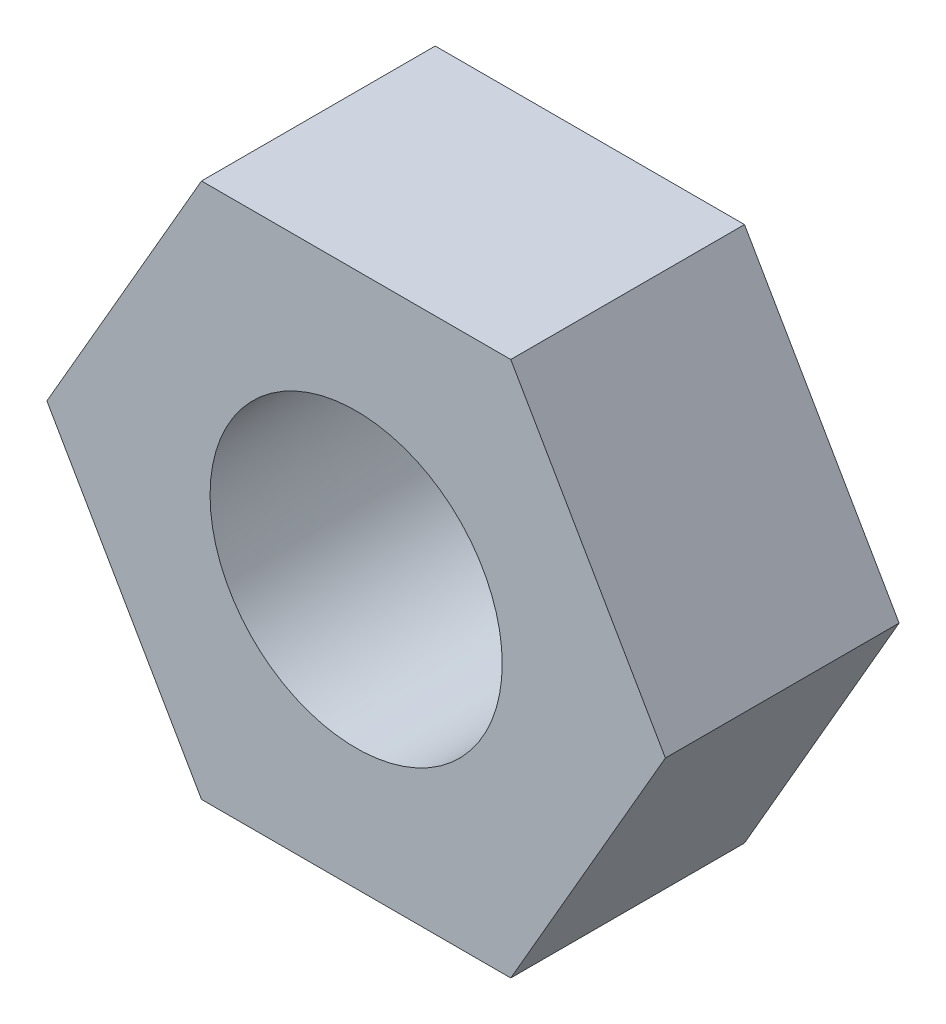
ISO-10303-21;
HEADER;
FILE_DESCRIPTION(('STEP AP214'),'2;1');
FILE_NAME('part.step','',(''),(''),'','','');
FILE_SCHEMA(('AUTOMOTIVE_DESIGN { 1 0 10303 214 1 1 1 1 }'));
ENDSEC;
DATA;
#1=APPLICATION_CONTEXT('core data for automotive mechanical design processes');
#2=APPLICATION_PROTOCOL_DEFINITION('international standard','automotive_design',2000,#1);
#3=PRODUCT_CONTEXT('',#1,'mechanical');
#4=PRODUCT('Part','Part','',(#3));
#5=PRODUCT_RELATED_PRODUCT_CATEGORY('part','',(#4));
#6=PRODUCT_DEFINITION_FORMATION('','',#4);
#7=PRODUCT_DEFINITION_CONTEXT('part definition',#1,'design');
#8=PRODUCT_DEFINITION('design','',#6,#7);
#9=PRODUCT_DEFINITION_SHAPE('','',#8);
#10=(LENGTH_UNIT() NAMED_UNIT(*) SI_UNIT(.MILLI.,.METRE.));
#11=(NAMED_UNIT(*) PLANE_ANGLE_UNIT() SI_UNIT($,.RADIAN.));
#12=(NAMED_UNIT(*) SI_UNIT($,.STERADIAN.) SOLID_ANGLE_UNIT());
#13=UNCERTAINTY_MEASURE_WITH_UNIT(LENGTH_MEASURE(1.E-05),#10,'distance_accuracy_value','');
#14=(GEOMETRIC_REPRESENTATION_CONTEXT(3) GLOBAL_UNCERTAINTY_ASSIGNED_CONTEXT((#13)) GLOBAL_UNIT_ASSIGNED_CONTEXT((#10,
#11,#12)) REPRESENTATION_CONTEXT('',''));
#15=CARTESIAN_POINT('',(0.,0.,0.));
#16=DIRECTION('',(0.,0.,1.));
#17=DIRECTION('',(1.,0.,0.));
#18=AXIS2_PLACEMENT_3D('',#15,#16,#17);
#19=CARTESIAN_POINT('',(1.58771324027147,-2.75000000000001,2.4));
#20=DIRECTION('',(-0.866025403784439,0.5,0.));
#21=DIRECTION('',(-0.5,-0.866025403784439,0.));
#22=AXIS2_PLACEMENT_3D('',#19,#20,#21);
#23=PLANE('',#22);
#24=DIRECTION('',(0.5,0.866025403784439,0.));
#25=VECTOR('',#24,1.);
#26=CARTESIAN_POINT('',(1.58771324027147,-2.75000000000001,0.));
#27=LINE('',#26,#25);
#28=CARTESIAN_POINT('',(1.58771324027147,-2.75000000000001,0.));
#29=VERTEX_POINT('',#28);
#30=CARTESIAN_POINT('',(3.17542648054295,0.,0.));
#31=VERTEX_POINT('',#30);
#32=EDGE_CURVE('E115',#29,#31,#27,.T.);
#33=ORIENTED_EDGE('',*,*,#32,.T.);
#34=DIRECTION('',(0.,0.,-1.));
#35=VECTOR('',#34,1.);
#36=CARTESIAN_POINT('',(3.17542648054295,0.,2.4));
#37=LINE('',#36,#35);
#38=CARTESIAN_POINT('',(3.17542648054295,0.,2.4));
#39=VERTEX_POINT('',#38);
#40=EDGE_CURVE('E11',#39,#31,#37,.T.);
#41=ORIENTED_EDGE('',*,*,#40,.F.);
#42=DIRECTION('',(0.5,0.866025403784439,0.));
#43=VECTOR('',#42,1.);
#44=CARTESIAN_POINT('',(1.58771324027147,-2.75000000000001,2.4));
#45=LINE('',#44,#43);
#46=CARTESIAN_POINT('',(1.58771324027147,-2.75000000000001,2.4));
#47=VERTEX_POINT('',#46);
#48=EDGE_CURVE('E126',#47,#39,#45,.T.);
#49=ORIENTED_EDGE('',*,*,#48,.F.);
#50=DIRECTION('',(0.,0.,-1.));
#51=VECTOR('',#50,1.);
#52=CARTESIAN_POINT('',(1.58771324027147,-2.75000000000001,2.4));
#53=LINE('',#52,#51);
#54=EDGE_CURVE('E111',#47,#29,#53,.T.);
#55=ORIENTED_EDGE('',*,*,#54,.T.);
#56=EDGE_LOOP('',(#33,#41,#49,#55));
#57=FACE_BOUND('',#56,.T.);
#58=ADVANCED_FACE('F31',(#57),#23,.F.);
#59=CARTESIAN_POINT('',(3.17542648054295,0.,2.4));
#60=DIRECTION('',(-0.866025403784438,-0.500000000000001,0.));
#61=DIRECTION('',(0.500000000000001,-0.866025403784438,0.));
#62=AXIS2_PLACEMENT_3D('',#59,#60,#61);
#63=PLANE('',#62);
#64=DIRECTION('',(-0.500000000000001,0.866025403784438,0.));
#65=VECTOR('',#64,1.);
#66=CARTESIAN_POINT('',(3.17542648054295,0.,0.));
#67=LINE('',#66,#65);
#68=CARTESIAN_POINT('',(1.58771324027146,2.75000000000003,0.));
#69=VERTEX_POINT('',#68);
#70=EDGE_CURVE('E118',#31,#69,#67,.T.);
#71=ORIENTED_EDGE('',*,*,#70,.T.);
#72=DIRECTION('',(0.,0.,-1.));
#73=VECTOR('',#72,1.);
#74=CARTESIAN_POINT('',(1.58771324027146,2.75000000000003,2.4));
#75=LINE('',#74,#73);
#76=CARTESIAN_POINT('',(1.58771324027146,2.75000000000003,2.4));
#77=VERTEX_POINT('',#76);
#78=EDGE_CURVE('E39',#77,#69,#75,.T.);
#79=ORIENTED_EDGE('',*,*,#78,.F.);
#80=DIRECTION('',(-0.500000000000001,0.866025403784438,0.));
#81=VECTOR('',#80,1.);
#82=CARTESIAN_POINT('',(3.17542648054295,0.,2.4));
#83=LINE('',#82,#81);
#84=EDGE_CURVE('E84',#39,#77,#83,.T.);
#85=ORIENTED_EDGE('',*,*,#84,.F.);
#86=ORIENTED_EDGE('',*,*,#40,.T.);
#87=EDGE_LOOP('',(#71,#79,#85,#86));
#88=FACE_BOUND('',#87,.T.);
#89=ADVANCED_FACE('F151',(#88),#63,.F.);
#90=CARTESIAN_POINT('',(1.58771324027146,2.75000000000003,2.4));
#91=DIRECTION('',(0.,-1.,0.));
#92=DIRECTION('',(0.,0.,-1.));
#93=AXIS2_PLACEMENT_3D('',#90,#91,#92);
#94=PLANE('',#93);
#95=DIRECTION('',(-1.,0.,0.));
#96=VECTOR('',#95,1.);
#97=CARTESIAN_POINT('',(1.58771324027146,2.75000000000003,0.));
#98=LINE('',#97,#96);
#99=CARTESIAN_POINT('',(-1.58771324027147,2.75000000000003,0.));
#100=VERTEX_POINT('',#99);
#101=EDGE_CURVE('E121',#69,#100,#98,.T.);
#102=ORIENTED_EDGE('',*,*,#101,.T.);
#103=DIRECTION('',(0.,0.,-1.));
#104=VECTOR('',#103,1.);
#105=CARTESIAN_POINT('',(-1.58771324027147,2.75000000000003,2.4));
#106=LINE('',#105,#104);
#107=CARTESIAN_POINT('',(-1.58771324027147,2.75000000000003,2.4));
#108=VERTEX_POINT('',#107);
#109=EDGE_CURVE('E106',#108,#100,#106,.T.);
#110=ORIENTED_EDGE('',*,*,#109,.F.);
#111=DIRECTION('',(-1.,0.,0.));
#112=VECTOR('',#111,1.);
#113=CARTESIAN_POINT('',(1.58771324027146,2.75000000000003,2.4));
#114=LINE('',#113,#112);
#115=EDGE_CURVE('E97',#77,#108,#114,.T.);
#116=ORIENTED_EDGE('',*,*,#115,.F.);
#117=ORIENTED_EDGE('',*,*,#78,.T.);
#118=EDGE_LOOP('',(#102,#110,#116,#117));
#119=FACE_BOUND('',#118,.T.);
#120=ADVANCED_FACE('F132',(#119),#94,.F.);
#121=CARTESIAN_POINT('',(-1.58771324027147,2.75000000000003,2.4));
#122=DIRECTION('',(0.866025403784438,-0.5,0.));
#123=DIRECTION('',(0.5,0.866025403784439,0.));
#124=AXIS2_PLACEMENT_3D('',#121,#122,#123);
#125=PLANE('',#124);
#126=DIRECTION('',(-0.5,-0.866025403784438,0.));
#127=VECTOR('',#126,1.);
#128=CARTESIAN_POINT('',(-1.58771324027147,2.75000000000003,0.));
#129=LINE('',#128,#127);
#130=CARTESIAN_POINT('',(-3.17542648054296,0.,0.));
#131=VERTEX_POINT('',#130);
#132=EDGE_CURVE('E105',#100,#131,#129,.T.);
#133=ORIENTED_EDGE('',*,*,#132,.T.);
#134=DIRECTION('',(0.,0.,-1.));
#135=VECTOR('',#134,1.);
#136=CARTESIAN_POINT('',(-3.17542648054296,0.,2.4));
#137=LINE('',#136,#135);
#138=CARTESIAN_POINT('',(-3.17542648054296,0.,2.4));
#139=VERTEX_POINT('',#138);
#140=EDGE_CURVE('E102',#139,#131,#137,.T.);
#141=ORIENTED_EDGE('',*,*,#140,.F.);
#142=DIRECTION('',(-0.5,-0.866025403784438,0.));
#143=VECTOR('',#142,1.);
#144=CARTESIAN_POINT('',(-1.58771324027147,2.75000000000003,2.4));
#145=LINE('',#144,#143);
#146=EDGE_CURVE('E91',#108,#139,#145,.T.);
#147=ORIENTED_EDGE('',*,*,#146,.F.);
#148=ORIENTED_EDGE('',*,*,#109,.T.);
#149=EDGE_LOOP('',(#133,#141,#147,#148));
#150=FACE_BOUND('',#149,.T.);
#151=ADVANCED_FACE('F103',(#150),#125,.F.);
#152=CARTESIAN_POINT('',(-3.17542648054296,0.,2.4));
#153=DIRECTION('',(0.866025403784438,0.500000000000001,0.));
#154=DIRECTION('',(-0.500000000000001,0.866025403784438,0.));
#155=AXIS2_PLACEMENT_3D('',#152,#153,#154);
#156=PLANE('',#155);
#157=DIRECTION('',(0.500000000000001,-0.866025403784438,0.));
#158=VECTOR('',#157,1.);
#159=CARTESIAN_POINT('',(-3.17542648054296,0.,0.));
#160=LINE('',#159,#158);
#161=CARTESIAN_POINT('',(-1.58771324027148,-2.75000000000001,0.));
#162=VERTEX_POINT('',#161);
#163=EDGE_CURVE('E70',#131,#162,#160,.T.);
#164=ORIENTED_EDGE('',*,*,#163,.T.);
#165=DIRECTION('',(0.,0.,-1.));
#166=VECTOR('',#165,1.);
#167=CARTESIAN_POINT('',(-1.58771324027148,-2.75000000000001,2.4));
#168=LINE('',#167,#166);
#169=CARTESIAN_POINT('',(-1.58771324027148,-2.75000000000001,2.4));
#170=VERTEX_POINT('',#169);
#171=EDGE_CURVE('E107',#170,#162,#168,.T.);
#172=ORIENTED_EDGE('',*,*,#171,.F.);
#173=DIRECTION('',(0.500000000000001,-0.866025403784438,0.));
#174=VECTOR('',#173,1.);
#175=CARTESIAN_POINT('',(-3.17542648054296,0.,2.4));
#176=LINE('',#175,#174);
#177=EDGE_CURVE('E95',#139,#170,#176,.T.);
#178=ORIENTED_EDGE('',*,*,#177,.F.);
#179=ORIENTED_EDGE('',*,*,#140,.T.);
#180=EDGE_LOOP('',(#164,#172,#178,#179));
#181=FACE_BOUND('',#180,.T.);
#182=ADVANCED_FACE('F109',(#181),#156,.F.);
#183=CARTESIAN_POINT('',(-1.58771324027148,-2.75000000000001,2.4));
#184=DIRECTION('',(0.,1.,0.));
#185=DIRECTION('',(0.,0.,1.));
#186=AXIS2_PLACEMENT_3D('',#183,#184,#185);
#187=PLANE('',#186);
#188=DIRECTION('',(1.,0.,0.));
#189=VECTOR('',#188,1.);
#190=CARTESIAN_POINT('',(-1.58771324027148,-2.75000000000001,0.));
#191=LINE('',#190,#189);
#192=EDGE_CURVE('E76',#162,#29,#191,.T.);
#193=ORIENTED_EDGE('',*,*,#192,.T.);
#194=ORIENTED_EDGE('',*,*,#54,.F.);
#195=DIRECTION('',(1.,0.,0.));
#196=VECTOR('',#195,1.);
#197=CARTESIAN_POINT('',(-1.58771324027148,-2.75000000000001,2.4));
#198=LINE('',#197,#196);
#199=EDGE_CURVE('E47',#170,#47,#198,.T.);
#200=ORIENTED_EDGE('',*,*,#199,.F.);
#201=ORIENTED_EDGE('',*,*,#171,.T.);
#202=EDGE_LOOP('',(#193,#194,#200,#201));
#203=FACE_BOUND('',#202,.T.);
#204=ADVANCED_FACE('F139',(#203),#187,.F.);
#205=CARTESIAN_POINT('',(3.17542648054295,0.,2.4));
#206=DIRECTION('',(0.,0.,1.));
#207=DIRECTION('',(1.,0.,0.));
#208=AXIS2_PLACEMENT_3D('',#205,#206,#207);
#209=PLANE('',#208);
#210=CARTESIAN_POINT('',(0.,0.,2.4));
#211=DIRECTION('',(0.,0.,1.));
#212=DIRECTION('',(1.,0.,0.));
#213=AXIS2_PLACEMENT_3D('',#210,#211,#212);
#214=CIRCLE('',#213,1.5);
#215=CARTESIAN_POINT('',(1.5,0.,2.4));
#216=VERTEX_POINT('',#215);
#217=EDGE_CURVE('E206',#216,#216,#214,.T.);
#218=ORIENTED_EDGE('',*,*,#217,.F.);
#219=EDGE_LOOP('',(#218));
#220=FACE_BOUND('',#219,.T.);
#221=ORIENTED_EDGE('',*,*,#48,.T.);
#222=ORIENTED_EDGE('',*,*,#84,.T.);
#223=ORIENTED_EDGE('',*,*,#115,.T.);
#224=ORIENTED_EDGE('',*,*,#146,.T.);
#225=ORIENTED_EDGE('',*,*,#177,.T.);
#226=ORIENTED_EDGE('',*,*,#199,.T.);
#227=EDGE_LOOP('',(#221,#222,#223,#224,#225,#226));
#228=FACE_BOUND('',#227,.T.);
#229=ADVANCED_FACE('F93',(#220,#228),#209,.T.);
#230=CARTESIAN_POINT('',(3.17542648054295,0.,0.));
#231=DIRECTION('',(0.,0.,1.));
#232=DIRECTION('',(1.,0.,0.));
#233=AXIS2_PLACEMENT_3D('',#230,#231,#232);
#234=PLANE('',#233);
#235=CARTESIAN_POINT('',(0.,0.,0.));
#236=DIRECTION('',(0.,0.,1.));
#237=DIRECTION('',(1.,0.,0.));
#238=AXIS2_PLACEMENT_3D('',#235,#236,#237);
#239=CIRCLE('',#238,1.5);
#240=CARTESIAN_POINT('',(1.5,0.,0.));
#241=VERTEX_POINT('',#240);
#242=EDGE_CURVE('E119',#241,#241,#239,.T.);
#243=ORIENTED_EDGE('',*,*,#242,.T.);
#244=EDGE_LOOP('',(#243));
#245=FACE_BOUND('',#244,.T.);
#246=ORIENTED_EDGE('',*,*,#32,.F.);
#247=ORIENTED_EDGE('',*,*,#192,.F.);
#248=ORIENTED_EDGE('',*,*,#163,.F.);
#249=ORIENTED_EDGE('',*,*,#132,.F.);
#250=ORIENTED_EDGE('',*,*,#101,.F.);
#251=ORIENTED_EDGE('',*,*,#70,.F.);
#252=EDGE_LOOP('',(#246,#247,#248,#249,#250,#251));
#253=FACE_BOUND('',#252,.T.);
#254=ADVANCED_FACE('F135',(#245,#253),#234,.F.);
#255=CARTESIAN_POINT('',(0.,0.,0.));
#256=DIRECTION('',(0.,0.,1.));
#257=DIRECTION('',(1.,0.,0.));
#258=AXIS2_PLACEMENT_3D('',#255,#256,#257);
#259=CYLINDRICAL_SURFACE('',#258,1.5);
#260=ORIENTED_EDGE('',*,*,#242,.F.);
#261=EDGE_LOOP('',(#260));
#262=FACE_BOUND('',#261,.T.);
#263=ORIENTED_EDGE('',*,*,#217,.T.);
#264=EDGE_LOOP('',(#263));
#265=FACE_BOUND('',#264,.T.);
#266=ADVANCED_FACE('F188',(#262,#265),#259,.F.);
#267=CLOSED_SHELL('',(#58,#89,#120,#151,#182,#204,#229,#254,#266));
#268=MANIFOLD_SOLID_BREP('B2',#267);
#269=ADVANCED_BREP_SHAPE_REPRESENTATION('',(#18,#268),#14);
#270=SHAPE_DEFINITION_REPRESENTATION(#9,#269);
ENDSEC;
END-ISO-10303-21;
